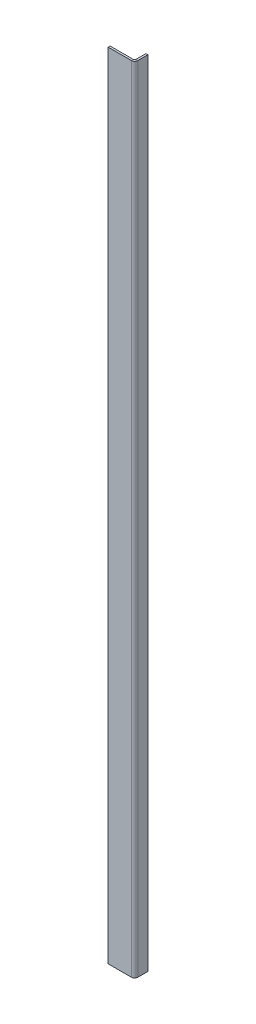
ISO-10303-21;
HEADER;
FILE_DESCRIPTION(('STEP AP214'),'2;1');
FILE_NAME('part.step','',(''),(''),'','','');
FILE_SCHEMA(('AUTOMOTIVE_DESIGN { 1 0 10303 214 1 1 1 1 }'));
ENDSEC;
DATA;
#1=APPLICATION_CONTEXT('core data for automotive mechanical design processes');
#2=APPLICATION_PROTOCOL_DEFINITION('international standard','automotive_design',2000,#1);
#3=PRODUCT_CONTEXT('',#1,'mechanical');
#4=PRODUCT('Part','Part','',(#3));
#5=PRODUCT_RELATED_PRODUCT_CATEGORY('part','',(#4));
#6=PRODUCT_DEFINITION_FORMATION('','',#4);
#7=PRODUCT_DEFINITION_CONTEXT('part definition',#1,'design');
#8=PRODUCT_DEFINITION('design','',#6,#7);
#9=PRODUCT_DEFINITION_SHAPE('','',#8);
#10=(LENGTH_UNIT() NAMED_UNIT(*) SI_UNIT(.MILLI.,.METRE.));
#11=(NAMED_UNIT(*) PLANE_ANGLE_UNIT() SI_UNIT($,.RADIAN.));
#12=(NAMED_UNIT(*) SI_UNIT($,.STERADIAN.) SOLID_ANGLE_UNIT());
#13=UNCERTAINTY_MEASURE_WITH_UNIT(LENGTH_MEASURE(1.E-05),#10,'distance_accuracy_value','');
#14=(GEOMETRIC_REPRESENTATION_CONTEXT(3) GLOBAL_UNCERTAINTY_ASSIGNED_CONTEXT((#13)) GLOBAL_UNIT_ASSIGNED_CONTEXT((#10,
#11,#12)) REPRESENTATION_CONTEXT('',''));
#15=CARTESIAN_POINT('',(0.,0.,0.));
#16=DIRECTION('',(0.,0.,1.));
#17=DIRECTION('',(1.,0.,0.));
#18=AXIS2_PLACEMENT_3D('',#15,#16,#17);
#19=CARTESIAN_POINT('',(-1616.42707967151,1530.,877.5));
#20=DIRECTION('',(0.,1.,0.));
#21=DIRECTION('',(1.,0.,0.));
#22=AXIS2_PLACEMENT_3D('',#19,#20,#21);
#23=PLANE('',#22);
#24=DIRECTION('',(1.,0.,0.));
#25=VECTOR('',#24,1.);
#26=CARTESIAN_POINT('',(-1616.42707967151,1530.,877.5));
#27=LINE('',#26,#25);
#28=CARTESIAN_POINT('',(-416.333333333333,1530.,877.5));
#29=VERTEX_POINT('',#28);
#30=CARTESIAN_POINT('',(-414.833333333333,1530.,877.5));
#31=VERTEX_POINT('',#30);
#32=EDGE_CURVE('E180',#29,#31,#27,.T.);
#33=ORIENTED_EDGE('',*,*,#32,.T.);
#34=DIRECTION('',(0.,0.,1.));
#35=VECTOR('',#34,1.);
#36=CARTESIAN_POINT('',(-414.833333333333,1530.,877.5));
#37=LINE('',#36,#35);
#38=CARTESIAN_POINT('',(-414.833333333333,1530.,870.));
#39=VERTEX_POINT('',#38);
#40=EDGE_CURVE('E56',#31,#39,#37,.F.);
#41=ORIENTED_EDGE('',*,*,#40,.T.);
#42=DIRECTION('',(1.,0.,0.));
#43=VECTOR('',#42,1.);
#44=CARTESIAN_POINT('',(-1616.42707967151,1530.,870.));
#45=LINE('',#44,#43);
#46=CARTESIAN_POINT('',(-416.333333333333,1530.,870.));
#47=VERTEX_POINT('',#46);
#48=EDGE_CURVE('E11',#47,#39,#45,.T.);
#49=ORIENTED_EDGE('',*,*,#48,.F.);
#50=DIRECTION('',(0.,0.,1.));
#51=VECTOR('',#50,1.);
#52=CARTESIAN_POINT('',(-416.333333333333,1530.,877.5));
#53=LINE('',#52,#51);
#54=EDGE_CURVE('E168',#47,#29,#53,.T.);
#55=ORIENTED_EDGE('',*,*,#54,.T.);
#56=EDGE_LOOP('',(#33,#41,#49,#55));
#57=FACE_BOUND('',#56,.T.);
#58=ADVANCED_FACE('F42',(#57),#23,.T.);
#59=CARTESIAN_POINT('',(-1616.42707967151,1530.,870.));
#60=DIRECTION('',(0.,0.,-1.));
#61=DIRECTION('',(-1.,0.,0.));
#62=AXIS2_PLACEMENT_3D('',#59,#60,#61);
#63=PLANE('',#62);
#64=ORIENTED_EDGE('',*,*,#48,.T.);
#65=DIRECTION('',(0.,1.,0.));
#66=VECTOR('',#65,1.);
#67=CARTESIAN_POINT('',(-414.833333333333,1530.,870.));
#68=LINE('',#67,#66);
#69=CARTESIAN_POINT('',(-414.833333333333,930.,870.));
#70=VERTEX_POINT('',#69);
#71=EDGE_CURVE('E62',#70,#39,#68,.T.);
#72=ORIENTED_EDGE('',*,*,#71,.F.);
#73=DIRECTION('',(1.,0.,0.));
#74=VECTOR('',#73,1.);
#75=CARTESIAN_POINT('',(-1616.42707967151,930.,870.));
#76=LINE('',#75,#74);
#77=CARTESIAN_POINT('',(-416.333333333333,930.,870.));
#78=VERTEX_POINT('',#77);
#79=EDGE_CURVE('E49',#78,#70,#76,.T.);
#80=ORIENTED_EDGE('',*,*,#79,.F.);
#81=DIRECTION('',(0.,1.,0.));
#82=VECTOR('',#81,1.);
#83=CARTESIAN_POINT('',(-416.333333333333,1530.,870.));
#84=LINE('',#83,#82);
#85=EDGE_CURVE('E171',#78,#47,#84,.T.);
#86=ORIENTED_EDGE('',*,*,#85,.T.);
#87=EDGE_LOOP('',(#64,#72,#80,#86));
#88=FACE_BOUND('',#87,.T.);
#89=ADVANCED_FACE('F206',(#88),#63,.T.);
#90=CARTESIAN_POINT('',(-1616.42707967151,930.,877.5));
#91=DIRECTION('',(0.,1.,0.));
#92=DIRECTION('',(1.,0.,0.));
#93=AXIS2_PLACEMENT_3D('',#90,#91,#92);
#94=PLANE('',#93);
#95=DIRECTION('',(0.,0.,1.));
#96=VECTOR('',#95,1.);
#97=CARTESIAN_POINT('',(-414.833333333333,930.,877.5));
#98=LINE('',#97,#96);
#99=CARTESIAN_POINT('',(-414.833333333333,930.,877.5));
#100=VERTEX_POINT('',#99);
#101=EDGE_CURVE('E145',#100,#70,#98,.F.);
#102=ORIENTED_EDGE('',*,*,#101,.F.);
#103=DIRECTION('',(1.,0.,0.));
#104=VECTOR('',#103,1.);
#105=CARTESIAN_POINT('',(-1616.42707967151,930.,877.5));
#106=LINE('',#105,#104);
#107=CARTESIAN_POINT('',(-416.333333333333,930.,877.5));
#108=VERTEX_POINT('',#107);
#109=EDGE_CURVE('E182',#108,#100,#106,.T.);
#110=ORIENTED_EDGE('',*,*,#109,.F.);
#111=DIRECTION('',(0.,0.,1.));
#112=VECTOR('',#111,1.);
#113=CARTESIAN_POINT('',(-416.333333333333,930.,877.5));
#114=LINE('',#113,#112);
#115=EDGE_CURVE('E174',#78,#108,#114,.T.);
#116=ORIENTED_EDGE('',*,*,#115,.F.);
#117=ORIENTED_EDGE('',*,*,#79,.T.);
#118=EDGE_LOOP('',(#102,#110,#116,#117));
#119=FACE_BOUND('',#118,.T.);
#120=ADVANCED_FACE('F187',(#119),#94,.F.);
#121=CARTESIAN_POINT('',(-416.333333333333,1530.,870.));
#122=DIRECTION('',(1.,0.,0.));
#123=DIRECTION('',(0.,1.,0.));
#124=AXIS2_PLACEMENT_3D('',#121,#122,#123);
#125=PLANE('',#124);
#126=ORIENTED_EDGE('',*,*,#54,.F.);
#127=ORIENTED_EDGE('',*,*,#85,.F.);
#128=ORIENTED_EDGE('',*,*,#115,.T.);
#129=DIRECTION('',(0.,-1.,0.));
#130=VECTOR('',#129,1.);
#131=CARTESIAN_POINT('',(-416.333333333333,1530.,877.5));
#132=LINE('',#131,#130);
#133=EDGE_CURVE('E177',#108,#29,#132,.F.);
#134=ORIENTED_EDGE('',*,*,#133,.T.);
#135=EDGE_LOOP('',(#126,#127,#128,#134));
#136=FACE_BOUND('',#135,.T.);
#137=ADVANCED_FACE('F193',(#136),#125,.F.);
#138=CARTESIAN_POINT('',(-414.833333333333,1530.,870.));
#139=DIRECTION('',(1.,0.,0.));
#140=DIRECTION('',(0.,1.,0.));
#141=AXIS2_PLACEMENT_3D('',#138,#139,#140);
#142=PLANE('',#141);
#143=ORIENTED_EDGE('',*,*,#101,.T.);
#144=ORIENTED_EDGE('',*,*,#71,.T.);
#145=ORIENTED_EDGE('',*,*,#40,.F.);
#146=DIRECTION('',(0.,1.,0.));
#147=VECTOR('',#146,1.);
#148=CARTESIAN_POINT('',(-414.833333333333,1530.,877.5));
#149=LINE('',#148,#147);
#150=EDGE_CURVE('E127',#31,#100,#149,.F.);
#151=ORIENTED_EDGE('',*,*,#150,.T.);
#152=EDGE_LOOP('',(#143,#144,#145,#151));
#153=FACE_BOUND('',#152,.T.);
#154=ADVANCED_FACE('F190',(#153),#142,.T.);
#155=CARTESIAN_POINT('',(-434.833333333326,1530.,-322.010308160659));
#156=DIRECTION('',(-1.,0.,0.));
#157=DIRECTION('',(0.,0.,1.));
#158=AXIS2_PLACEMENT_3D('',#155,#156,#157);
#159=PLANE('',#158);
#160=DIRECTION('',(0.,0.,1.));
#161=VECTOR('',#160,1.);
#162=CARTESIAN_POINT('',(-434.833333333326,930.,-322.010308160659));
#163=LINE('',#162,#161);
#164=CARTESIAN_POINT('',(-434.833333333333,930.,878.5));
#165=VERTEX_POINT('',#164);
#166=CARTESIAN_POINT('',(-434.833333333333,930.,880.));
#167=VERTEX_POINT('',#166);
#168=EDGE_CURVE('E118',#165,#167,#163,.T.);
#169=ORIENTED_EDGE('',*,*,#168,.T.);
#170=DIRECTION('',(0.,-1.,0.));
#171=VECTOR('',#170,1.);
#172=CARTESIAN_POINT('',(-434.833333333333,1530.,880.));
#173=LINE('',#172,#171);
#174=CARTESIAN_POINT('',(-434.833333333333,1530.,880.));
#175=VERTEX_POINT('',#174);
#176=EDGE_CURVE('E158',#167,#175,#173,.F.);
#177=ORIENTED_EDGE('',*,*,#176,.T.);
#178=DIRECTION('',(0.,0.,1.));
#179=VECTOR('',#178,1.);
#180=CARTESIAN_POINT('',(-434.833333333326,1530.,-322.010308160659));
#181=LINE('',#180,#179);
#182=CARTESIAN_POINT('',(-434.833333333333,1530.,878.5));
#183=VERTEX_POINT('',#182);
#184=EDGE_CURVE('E139',#183,#175,#181,.T.);
#185=ORIENTED_EDGE('',*,*,#184,.F.);
#186=DIRECTION('',(0.,1.,0.));
#187=VECTOR('',#186,1.);
#188=CARTESIAN_POINT('',(-434.833333333333,1530.,878.5));
#189=LINE('',#188,#187);
#190=EDGE_CURVE('E156',#183,#165,#189,.F.);
#191=ORIENTED_EDGE('',*,*,#190,.T.);
#192=EDGE_LOOP('',(#169,#177,#185,#191));
#193=FACE_BOUND('',#192,.T.);
#194=ADVANCED_FACE('F192',(#193),#159,.T.);
#195=CARTESIAN_POINT('',(-414.833333333333,1530.,878.5));
#196=DIRECTION('',(0.,0.,1.));
#197=DIRECTION('',(1.,0.,0.));
#198=AXIS2_PLACEMENT_3D('',#195,#196,#197);
#199=PLANE('',#198);
#200=DIRECTION('',(1.,0.,0.));
#201=VECTOR('',#200,1.);
#202=CARTESIAN_POINT('',(-414.833333333333,1530.,878.5));
#203=LINE('',#202,#201);
#204=CARTESIAN_POINT('',(-417.333333333333,1530.,878.5));
#205=VERTEX_POINT('',#204);
#206=EDGE_CURVE('E143',#205,#183,#203,.F.);
#207=ORIENTED_EDGE('',*,*,#206,.F.);
#208=DIRECTION('',(0.,1.,0.));
#209=VECTOR('',#208,1.);
#210=CARTESIAN_POINT('',(-417.333333333333,1530.,878.5));
#211=LINE('',#210,#209);
#212=CARTESIAN_POINT('',(-417.333333333333,930.,878.5));
#213=VERTEX_POINT('',#212);
#214=EDGE_CURVE('E119',#213,#205,#211,.T.);
#215=ORIENTED_EDGE('',*,*,#214,.F.);
#216=DIRECTION('',(1.,0.,0.));
#217=VECTOR('',#216,1.);
#218=CARTESIAN_POINT('',(-414.833333333333,930.,878.5));
#219=LINE('',#218,#217);
#220=EDGE_CURVE('E151',#165,#213,#219,.T.);
#221=ORIENTED_EDGE('',*,*,#220,.F.);
#222=ORIENTED_EDGE('',*,*,#190,.F.);
#223=EDGE_LOOP('',(#207,#215,#221,#222));
#224=FACE_BOUND('',#223,.T.);
#225=ADVANCED_FACE('F199',(#224),#199,.F.);
#226=CARTESIAN_POINT('',(-414.833333333326,930.,-322.010308160659));
#227=DIRECTION('',(0.,-1.,0.));
#228=DIRECTION('',(0.,0.,-1.));
#229=AXIS2_PLACEMENT_3D('',#226,#227,#228);
#230=PLANE('',#229);
#231=DIRECTION('',(0.,0.,1.));
#232=VECTOR('',#231,1.);
#233=CARTESIAN_POINT('',(-417.333333333326,930.,-322.010308160659));
#234=LINE('',#233,#232);
#235=CARTESIAN_POINT('',(-417.333333333333,930.,880.));
#236=VERTEX_POINT('',#235);
#237=EDGE_CURVE('E154',#213,#236,#234,.T.);
#238=ORIENTED_EDGE('',*,*,#237,.T.);
#239=DIRECTION('',(1.,0.,0.));
#240=VECTOR('',#239,1.);
#241=CARTESIAN_POINT('',(-417.333333333333,930.,880.));
#242=LINE('',#241,#240);
#243=EDGE_CURVE('E137',#167,#236,#242,.T.);
#244=ORIENTED_EDGE('',*,*,#243,.F.);
#245=ORIENTED_EDGE('',*,*,#168,.F.);
#246=ORIENTED_EDGE('',*,*,#220,.T.);
#247=EDGE_LOOP('',(#238,#244,#245,#246));
#248=FACE_BOUND('',#247,.T.);
#249=ADVANCED_FACE('F223',(#248),#230,.T.);
#250=CARTESIAN_POINT('',(-414.833333333333,1530.,880.));
#251=DIRECTION('',(0.,0.,1.));
#252=DIRECTION('',(1.,0.,0.));
#253=AXIS2_PLACEMENT_3D('',#250,#251,#252);
#254=PLANE('',#253);
#255=ORIENTED_EDGE('',*,*,#243,.T.);
#256=DIRECTION('',(0.,1.,0.));
#257=VECTOR('',#256,1.);
#258=CARTESIAN_POINT('',(-417.333333333333,1530.,880.));
#259=LINE('',#258,#257);
#260=CARTESIAN_POINT('',(-417.333333333333,1530.,880.));
#261=VERTEX_POINT('',#260);
#262=EDGE_CURVE('E124',#236,#261,#259,.T.);
#263=ORIENTED_EDGE('',*,*,#262,.T.);
#264=DIRECTION('',(1.,0.,0.));
#265=VECTOR('',#264,1.);
#266=CARTESIAN_POINT('',(-416.333333333333,1530.,880.));
#267=LINE('',#266,#265);
#268=EDGE_CURVE('E134',#175,#261,#267,.T.);
#269=ORIENTED_EDGE('',*,*,#268,.F.);
#270=ORIENTED_EDGE('',*,*,#176,.F.);
#271=EDGE_LOOP('',(#255,#263,#269,#270));
#272=FACE_BOUND('',#271,.T.);
#273=ADVANCED_FACE('F133',(#272),#254,.T.);
#274=CARTESIAN_POINT('',(-414.833333333326,1530.,-322.010308160659));
#275=DIRECTION('',(0.,1.,0.));
#276=DIRECTION('',(0.,0.,1.));
#277=AXIS2_PLACEMENT_3D('',#274,#275,#276);
#278=PLANE('',#277);
#279=ORIENTED_EDGE('',*,*,#184,.T.);
#280=ORIENTED_EDGE('',*,*,#268,.T.);
#281=DIRECTION('',(0.,0.,1.));
#282=VECTOR('',#281,1.);
#283=CARTESIAN_POINT('',(-417.333333333326,1530.,-322.010308160659));
#284=LINE('',#283,#282);
#285=EDGE_CURVE('E108',#205,#261,#284,.T.);
#286=ORIENTED_EDGE('',*,*,#285,.F.);
#287=ORIENTED_EDGE('',*,*,#206,.T.);
#288=EDGE_LOOP('',(#279,#280,#286,#287));
#289=FACE_BOUND('',#288,.T.);
#290=ADVANCED_FACE('F142',(#289),#278,.T.);
#291=CARTESIAN_POINT('',(-417.333333333333,1530.,877.5));
#292=DIRECTION('',(0.,1.,0.));
#293=DIRECTION('',(0.,0.,1.));
#294=AXIS2_PLACEMENT_3D('',#291,#292,#293);
#295=PLANE('',#294);
#296=ORIENTED_EDGE('',*,*,#32,.F.);
#297=CARTESIAN_POINT('',(-417.333333333333,1530.,877.5));
#298=DIRECTION('',(0.,-1.,0.));
#299=DIRECTION('',(0.,0.,-1.));
#300=AXIS2_PLACEMENT_3D('',#297,#298,#299);
#301=CIRCLE('',#300,1.00000000000004);
#302=EDGE_CURVE('E113',#29,#205,#301,.T.);
#303=ORIENTED_EDGE('',*,*,#302,.T.);
#304=ORIENTED_EDGE('',*,*,#285,.T.);
#305=CARTESIAN_POINT('',(-417.333333333333,1530.,877.5));
#306=DIRECTION('',(0.,-1.,0.));
#307=DIRECTION('',(0.,0.,-1.));
#308=AXIS2_PLACEMENT_3D('',#305,#306,#307);
#309=CIRCLE('',#308,2.49999999999977);
#310=EDGE_CURVE('E111',#31,#261,#309,.T.);
#311=ORIENTED_EDGE('',*,*,#310,.F.);
#312=EDGE_LOOP('',(#296,#303,#304,#311));
#313=FACE_BOUND('',#312,.T.);
#314=ADVANCED_FACE('F110',(#313),#295,.T.);
#315=CARTESIAN_POINT('',(-417.333333333333,930.,877.5));
#316=DIRECTION('',(0.,-1.,0.));
#317=DIRECTION('',(0.,0.,-1.));
#318=AXIS2_PLACEMENT_3D('',#315,#316,#317);
#319=PLANE('',#318);
#320=CARTESIAN_POINT('',(-417.333333333333,930.,877.5));
#321=DIRECTION('',(0.,-1.,0.));
#322=DIRECTION('',(0.,0.,-1.));
#323=AXIS2_PLACEMENT_3D('',#320,#321,#322);
#324=CIRCLE('',#323,1.00000000000004);
#325=EDGE_CURVE('E129',#213,#108,#324,.F.);
#326=ORIENTED_EDGE('',*,*,#325,.T.);
#327=ORIENTED_EDGE('',*,*,#109,.T.);
#328=CARTESIAN_POINT('',(-417.333333333333,930.,877.5));
#329=DIRECTION('',(0.,-1.,0.));
#330=DIRECTION('',(0.,0.,-1.));
#331=AXIS2_PLACEMENT_3D('',#328,#329,#330);
#332=CIRCLE('',#331,2.49999999999977);
#333=EDGE_CURVE('E128',#236,#100,#332,.F.);
#334=ORIENTED_EDGE('',*,*,#333,.F.);
#335=ORIENTED_EDGE('',*,*,#237,.F.);
#336=EDGE_LOOP('',(#326,#327,#334,#335));
#337=FACE_BOUND('',#336,.T.);
#338=ADVANCED_FACE('F218',(#337),#319,.T.);
#339=CARTESIAN_POINT('',(-417.333333333333,2130.6317507425,877.5));
#340=DIRECTION('',(0.,-1.,0.));
#341=DIRECTION('',(0.,0.,-1.));
#342=AXIS2_PLACEMENT_3D('',#339,#340,#341);
#343=CYLINDRICAL_SURFACE('',#342,2.49999999999977);
#344=ORIENTED_EDGE('',*,*,#262,.F.);
#345=ORIENTED_EDGE('',*,*,#333,.T.);
#346=ORIENTED_EDGE('',*,*,#150,.F.);
#347=ORIENTED_EDGE('',*,*,#310,.T.);
#348=EDGE_LOOP('',(#344,#345,#346,#347));
#349=FACE_BOUND('',#348,.T.);
#350=ADVANCED_FACE('F123',(#349),#343,.T.);
#351=CARTESIAN_POINT('',(-417.333333333333,2130.6317507425,877.5));
#352=DIRECTION('',(0.,-1.,0.));
#353=DIRECTION('',(0.,0.,-1.));
#354=AXIS2_PLACEMENT_3D('',#351,#352,#353);
#355=CYLINDRICAL_SURFACE('',#354,1.00000000000004);
#356=ORIENTED_EDGE('',*,*,#214,.T.);
#357=ORIENTED_EDGE('',*,*,#302,.F.);
#358=ORIENTED_EDGE('',*,*,#133,.F.);
#359=ORIENTED_EDGE('',*,*,#325,.F.);
#360=EDGE_LOOP('',(#356,#357,#358,#359));
#361=FACE_BOUND('',#360,.T.);
#362=ADVANCED_FACE('F211',(#361),#355,.F.);
#363=CLOSED_SHELL('',(#58,#89,#120,#137,#154,#194,#225,#249,#273,#290,#314,#338,#350,#362));
#364=MANIFOLD_SOLID_BREP('B2',#363);
#365=ADVANCED_BREP_SHAPE_REPRESENTATION('',(#18,#364),#14);
#366=SHAPE_DEFINITION_REPRESENTATION(#9,#365);
ENDSEC;
END-ISO-10303-21;
